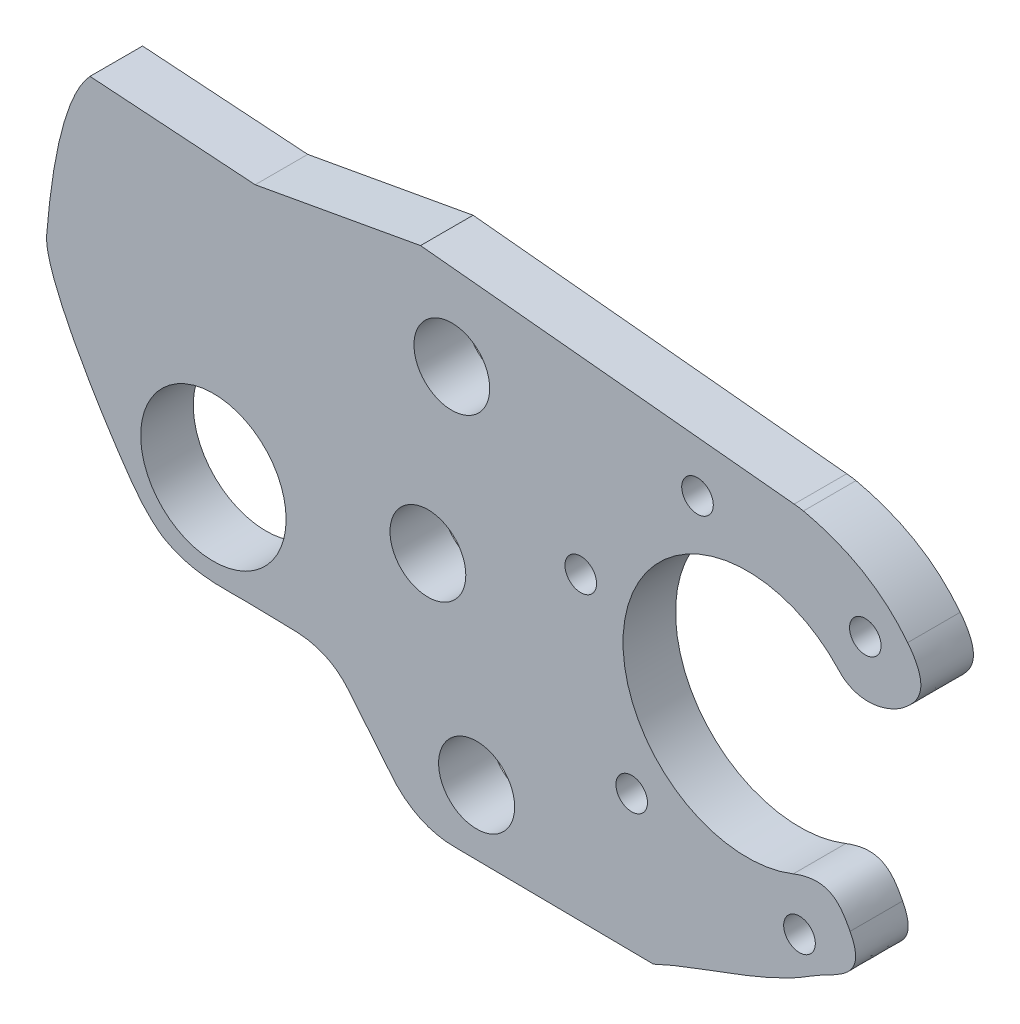
ISO-10303-21;
HEADER;
FILE_DESCRIPTION(('STEP AP214'),'2;1');
FILE_NAME('part.step','',(''),(''),'','','');
FILE_SCHEMA(('AUTOMOTIVE_DESIGN { 1 0 10303 214 1 1 1 1 }'));
ENDSEC;
DATA;
#1=APPLICATION_CONTEXT('core data for automotive mechanical design processes');
#2=APPLICATION_PROTOCOL_DEFINITION('international standard','automotive_design',2000,#1);
#3=PRODUCT_CONTEXT('',#1,'mechanical');
#4=PRODUCT('Part','Part','',(#3));
#5=PRODUCT_RELATED_PRODUCT_CATEGORY('part','',(#4));
#6=PRODUCT_DEFINITION_FORMATION('','',#4);
#7=PRODUCT_DEFINITION_CONTEXT('part definition',#1,'design');
#8=PRODUCT_DEFINITION('design','',#6,#7);
#9=PRODUCT_DEFINITION_SHAPE('','',#8);
#10=(LENGTH_UNIT() NAMED_UNIT(*) SI_UNIT(.MILLI.,.METRE.));
#11=(NAMED_UNIT(*) PLANE_ANGLE_UNIT() SI_UNIT($,.RADIAN.));
#12=(NAMED_UNIT(*) SI_UNIT($,.STERADIAN.) SOLID_ANGLE_UNIT());
#13=UNCERTAINTY_MEASURE_WITH_UNIT(LENGTH_MEASURE(1.E-05),#10,'distance_accuracy_value','');
#14=(GEOMETRIC_REPRESENTATION_CONTEXT(3) GLOBAL_UNCERTAINTY_ASSIGNED_CONTEXT((#13)) GLOBAL_UNIT_ASSIGNED_CONTEXT((#10,
#11,#12)) REPRESENTATION_CONTEXT('',''));
#15=CARTESIAN_POINT('',(0.,0.,0.));
#16=DIRECTION('',(0.,0.,1.));
#17=DIRECTION('',(1.,0.,0.));
#18=AXIS2_PLACEMENT_3D('',#15,#16,#17);
#19=CARTESIAN_POINT('',(186.901275,436.652765625,7.5));
#20=DIRECTION('',(0.,0.,-1.));
#21=DIRECTION('',(-1.,0.,0.));
#22=AXIS2_PLACEMENT_3D('',#19,#20,#21);
#23=PLANE('',#22);
#24=DIRECTION('',(-0.995119987414182,0.0986722384908675,0.));
#25=VECTOR('',#24,1.);
#26=CARTESIAN_POINT('',(291.70285305092,443.851443710822,7.5));
#27=LINE('',#26,#25);
#28=CARTESIAN_POINT('',(291.70285305092,443.851443710822,7.5));
#29=VERTEX_POINT('',#28);
#30=CARTESIAN_POINT('',(238.3788,449.13885,7.5));
#31=VERTEX_POINT('',#30);
#32=EDGE_CURVE('E1516',#29,#31,#27,.T.);
#33=ORIENTED_EDGE('',*,*,#32,.T.);
#34=DIRECTION('',(-0.983980109940813,-0.178278274730446,0.));
#35=VECTOR('',#34,1.);
#36=CARTESIAN_POINT('',(238.3788,449.13885,7.5));
#37=LINE('',#36,#35);
#38=CARTESIAN_POINT('',(214.781925,444.86355,7.5));
#39=VERTEX_POINT('',#38);
#40=EDGE_CURVE('E1289',#31,#39,#37,.T.);
#41=ORIENTED_EDGE('',*,*,#40,.T.);
#42=DIRECTION('',(-0.997687499739469,0.067968028245694,0.));
#43=VECTOR('',#42,1.);
#44=CARTESIAN_POINT('',(214.781925,444.86355,7.5));
#45=LINE('',#44,#43);
#46=CARTESIAN_POINT('',(191.205975,446.469675,7.5));
#47=VERTEX_POINT('',#46);
#48=EDGE_CURVE('E1510',#39,#47,#45,.T.);
#49=ORIENTED_EDGE('',*,*,#48,.T.);
#50=CARTESIAN_POINT('',(191.205975,446.469675,7.5));
#51=CARTESIAN_POINT('',(187.31175,442.230225,7.5));
#52=CARTESIAN_POINT('',(185.682225,432.103575,7.5));
#53=CARTESIAN_POINT('',(185.0223,423.75105,7.5));
#54=B_SPLINE_CURVE_WITH_KNOTS('',3,(#50,#51,#52,#53),.UNSPECIFIED.,.F.,.F.,(4,4),
(0.333333333333333,0.375),.UNSPECIFIED.);
#55=CARTESIAN_POINT('',(185.0223,423.75105,7.5));
#56=VERTEX_POINT('',#55);
#57=EDGE_CURVE('E1502',#47,#56,#54,.T.);
#58=ORIENTED_EDGE('',*,*,#57,.T.);
#59=CARTESIAN_POINT('',(185.0223,423.75105,7.5));
#60=CARTESIAN_POINT('',(184.6902,419.547675,7.5));
#61=CARTESIAN_POINT('',(190.36995,409.442775,7.5));
#62=CARTESIAN_POINT('',(195.177075,402.2091,7.5));
#63=B_SPLINE_CURVE_WITH_KNOTS('',3,(#59,#60,#61,#62),.UNSPECIFIED.,.F.,.F.,(4,4),(0.375,
0.416666666666667),.UNSPECIFIED.);
#64=CARTESIAN_POINT('',(195.177075,402.2091,7.5));
#65=VERTEX_POINT('',#64);
#66=EDGE_CURVE('E1498',#56,#65,#63,.T.);
#67=ORIENTED_EDGE('',*,*,#66,.T.);
#68=CARTESIAN_POINT('',(195.177075,402.2091,7.5));
#69=CARTESIAN_POINT('',(196.448625,400.2957,7.5));
#70=CARTESIAN_POINT('',(199.047375,396.168075,7.5));
#71=CARTESIAN_POINT('',(202.037325,394.500075,7.5));
#72=B_SPLINE_CURVE_WITH_KNOTS('',3,(#68,#69,#70,#71),.UNSPECIFIED.,.F.,.F.,(4,4),
(0.416666666666667,0.458333333333333),.UNSPECIFIED.);
#73=CARTESIAN_POINT('',(202.037325,394.500075,7.5));
#74=VERTEX_POINT('',#73);
#75=EDGE_CURVE('E1475',#65,#74,#72,.T.);
#76=ORIENTED_EDGE('',*,*,#75,.T.);
#77=CARTESIAN_POINT('',(202.037325,394.500075,7.5));
#78=CARTESIAN_POINT('',(206.034375,392.27025,7.5));
#79=CARTESIAN_POINT('',(210.701175,392.759325,7.5));
#80=CARTESIAN_POINT('',(213.541125,392.699775,7.5));
#81=B_SPLINE_CURVE_WITH_KNOTS('',3,(#77,#78,#79,#80),.UNSPECIFIED.,.F.,.F.,(4,4),
(0.458333333333333,0.5),.UNSPECIFIED.);
#82=CARTESIAN_POINT('',(213.541125,392.699775,7.5));
#83=VERTEX_POINT('',#82);
#84=EDGE_CURVE('E1470',#74,#83,#81,.T.);
#85=ORIENTED_EDGE('',*,*,#84,.T.);
#86=DIRECTION('',(0.999780220810121,-0.0209644956262963,0.));
#87=VECTOR('',#86,1.);
#88=CARTESIAN_POINT('',(213.541125,392.699775,7.5));
#89=LINE('',#88,#87);
#90=CARTESIAN_POINT('',(220.73385,392.54895,7.5));
#91=VERTEX_POINT('',#90);
#92=EDGE_CURVE('E1465',#83,#91,#89,.T.);
#93=ORIENTED_EDGE('',*,*,#92,.T.);
#94=CARTESIAN_POINT('',(220.73385,392.54895,7.5));
#95=CARTESIAN_POINT('',(223.992,392.3922,7.5));
#96=CARTESIAN_POINT('',(226.402275,391.1475,7.5));
#97=CARTESIAN_POINT('',(228.123675,389.018625,7.5));
#98=B_SPLINE_CURVE_WITH_KNOTS('',3,(#94,#95,#96,#97),.UNSPECIFIED.,.F.,.F.,(4,4),
(0.541666666666667,0.583333333333333),.UNSPECIFIED.);
#99=CARTESIAN_POINT('',(228.123675,389.018625,7.5));
#100=VERTEX_POINT('',#99);
#101=EDGE_CURVE('E1460',#91,#100,#98,.T.);
#102=ORIENTED_EDGE('',*,*,#101,.T.);
#103=DIRECTION('',(0.63643970205706,-0.771326458541078,0.));
#104=VECTOR('',#103,1.);
#105=CARTESIAN_POINT('',(228.123675,389.018625,7.5));
#106=LINE('',#105,#104);
#107=CARTESIAN_POINT('',(234.8802,380.830125,7.5));
#108=VERTEX_POINT('',#107);
#109=EDGE_CURVE('E1441',#100,#108,#106,.T.);
#110=ORIENTED_EDGE('',*,*,#109,.T.);
#111=CARTESIAN_POINT('',(234.8802,380.830125,7.5));
#112=CARTESIAN_POINT('',(237.1203,378.529425,7.5));
#113=CARTESIAN_POINT('',(239.8887,377.236575,7.5));
#114=CARTESIAN_POINT('',(243.337425,377.241825,7.5));
#115=B_SPLINE_CURVE_WITH_KNOTS('',3,(#111,#112,#113,#114),.UNSPECIFIED.,.F.,.F.,(4,4),(0.625,
0.666666666666667),.UNSPECIFIED.);
#116=CARTESIAN_POINT('',(243.337425,377.241825,7.5));
#117=VERTEX_POINT('',#116);
#118=EDGE_CURVE('E1436',#108,#117,#115,.T.);
#119=ORIENTED_EDGE('',*,*,#118,.T.);
#120=DIRECTION('',(0.999944246195797,-0.0105595691161274,0.));
#121=VECTOR('',#120,1.);
#122=CARTESIAN_POINT('',(243.337425,377.241825,7.5));
#123=LINE('',#122,#121);
#124=CARTESIAN_POINT('',(271.61115,376.94325,7.5));
#125=VERTEX_POINT('',#124);
#126=EDGE_CURVE('E1431',#117,#125,#123,.T.);
#127=ORIENTED_EDGE('',*,*,#126,.T.);
#128=CARTESIAN_POINT('',(271.61115,376.94325,7.5));
#129=CARTESIAN_POINT('',(277.799025,379.931025,7.5));
#130=CARTESIAN_POINT('',(287.4342,382.395075,7.5));
#131=CARTESIAN_POINT('',(293.921475,386.607675,7.5));
#132=B_SPLINE_CURVE_WITH_KNOTS('',3,(#128,#129,#130,#131),.UNSPECIFIED.,.F.,.F.,(4,4),
(0.708333333333333,0.75),.UNSPECIFIED.);
#133=CARTESIAN_POINT('',(293.921475,386.607675,7.5));
#134=VERTEX_POINT('',#133);
#135=EDGE_CURVE('E1426',#125,#134,#132,.T.);
#136=ORIENTED_EDGE('',*,*,#135,.T.);
#137=CARTESIAN_POINT('',(293.921475,386.607675,7.5));
#138=CARTESIAN_POINT('',(297.470175,388.91205,7.5));
#139=CARTESIAN_POINT('',(302.414025,389.714325,7.5));
#140=CARTESIAN_POINT('',(299.685525,395.036775,7.5));
#141=B_SPLINE_CURVE_WITH_KNOTS('',3,(#137,#138,#139,#140),.UNSPECIFIED.,.F.,.F.,(4,4),(0.75,
0.791666666666667),.UNSPECIFIED.);
#142=CARTESIAN_POINT('',(299.685525,395.036775,7.5));
#143=VERTEX_POINT('',#142);
#144=EDGE_CURVE('E1404',#134,#143,#141,.T.);
#145=ORIENTED_EDGE('',*,*,#144,.T.);
#146=CARTESIAN_POINT('',(299.685525,395.036775,7.5));
#147=CARTESIAN_POINT('',(298.2723,397.793175,7.5));
#148=CARTESIAN_POINT('',(296.635425,400.0548,7.5));
#149=CARTESIAN_POINT('',(291.575925,398.08245,7.5));
#150=B_SPLINE_CURVE_WITH_KNOTS('',3,(#146,#147,#148,#149),.UNSPECIFIED.,.F.,.F.,(4,4),
(0.791666666666667,0.833333333333333),.UNSPECIFIED.);
#151=CARTESIAN_POINT('',(291.575925,398.08245,7.5));
#152=VERTEX_POINT('',#151);
#153=EDGE_CURVE('E1399',#143,#152,#150,.T.);
#154=ORIENTED_EDGE('',*,*,#153,.T.);
#155=CARTESIAN_POINT('',(285.000663350942,414.538105839851,7.5));
#156=DIRECTION('',(0.,0.,1.));
#157=DIRECTION('',(1.,0.,0.));
#158=AXIS2_PLACEMENT_3D('',#155,#156,#157);
#159=CIRCLE('',#158,17.7206849436809);
#160=CARTESIAN_POINT('',(298.09630305092,426.476568710822,7.5));
#161=VERTEX_POINT('',#160);
#162=EDGE_CURVE('E1393',#161,#152,#159,.T.);
#163=ORIENTED_EDGE('',*,*,#162,.F.);
#164=CARTESIAN_POINT('',(298.09630305092,426.476568710822,7.5));
#165=CARTESIAN_POINT('',(300.69820305092,423.683793710822,7.5));
#166=CARTESIAN_POINT('',(304.86422805092,424.630818710822,7.5));
#167=CARTESIAN_POINT('',(307.32017805092,426.508218710822,7.5));
#168=B_SPLINE_CURVE_WITH_KNOTS('',3,(#164,#165,#166,#167),.UNSPECIFIED.,.F.,.F.,(4,4),
(0.0416666666666667,0.0833333333333333),.UNSPECIFIED.);
#169=CARTESIAN_POINT('',(307.32017805092,426.508218710822,7.5));
#170=VERTEX_POINT('',#169);
#171=EDGE_CURVE('E1345',#161,#170,#168,.T.);
#172=ORIENTED_EDGE('',*,*,#171,.T.);
#173=CARTESIAN_POINT('',(307.32017805092,426.508218710822,7.5));
#174=CARTESIAN_POINT('',(309.79840305092,428.402718710822,7.5));
#175=CARTESIAN_POINT('',(311.07040305092,430.794468710822,7.5));
#176=CARTESIAN_POINT('',(307.90405305092,434.828718710822,7.5));
#177=B_SPLINE_CURVE_WITH_KNOTS('',3,(#173,#174,#175,#176),.UNSPECIFIED.,.F.,.F.,(4,4),
(0.0833333333333333,0.125),.UNSPECIFIED.);
#178=CARTESIAN_POINT('',(307.90405305092,434.828718710822,7.5));
#179=VERTEX_POINT('',#178);
#180=EDGE_CURVE('E1338',#170,#179,#177,.T.);
#181=ORIENTED_EDGE('',*,*,#180,.T.);
#182=CARTESIAN_POINT('',(307.90405305092,434.828718710822,7.5));
#183=CARTESIAN_POINT('',(304.19552805092,439.553943710822,7.5));
#184=CARTESIAN_POINT('',(299.18740305092,442.280868710823,7.5));
#185=CARTESIAN_POINT('',(293.02682805092,443.659818710822,7.5));
#186=B_SPLINE_CURVE_WITH_KNOTS('',3,(#182,#183,#184,#185),.UNSPECIFIED.,.F.,.F.,(4,4),(0.125,
0.166666666666667),.UNSPECIFIED.);
#187=CARTESIAN_POINT('',(293.02682805092,443.659818710822,7.5));
#188=VERTEX_POINT('',#187);
#189=EDGE_CURVE('E1342',#179,#188,#186,.T.);
#190=ORIENTED_EDGE('',*,*,#189,.T.);
#191=CARTESIAN_POINT('',(293.02682805092,443.659818710822,7.5));
#192=CARTESIAN_POINT('',(292.62767805092,443.749143710822,7.5));
#193=CARTESIAN_POINT('',(292.12420305092,443.810118710822,7.5));
#194=CARTESIAN_POINT('',(291.70285305092,443.851443710822,7.5));
#195=B_SPLINE_CURVE_WITH_KNOTS('',3,(#191,#192,#193,#194),.UNSPECIFIED.,.F.,.F.,(4,4),
(0.166666666666667,0.208333333333333),.UNSPECIFIED.);
#196=EDGE_CURVE('E1210',#188,#29,#195,.T.);
#197=ORIENTED_EDGE('',*,*,#196,.T.);
#198=EDGE_LOOP('',(#33,#41,#49,#58,#67,#76,#85,#93,#102,#110,#119,#127,#136,#145,#154,#163,#172,
#181,#190,#197));
#199=FACE_BOUND('',#198,.T.);
#200=CARTESIAN_POINT('',(208.817803892442,405.705736446067,7.5));
#201=DIRECTION('',(0.,0.,1.));
#202=DIRECTION('',(1.,0.,0.));
#203=AXIS2_PLACEMENT_3D('',#200,#201,#202);
#204=CIRCLE('',#203,10.3764639600331);
#205=CARTESIAN_POINT('',(219.194267852475,405.705736446067,7.5));
#206=VERTEX_POINT('',#205);
#207=EDGE_CURVE('E1521',#206,#206,#204,.T.);
#208=ORIENTED_EDGE('',*,*,#207,.F.);
#209=EDGE_LOOP('',(#208));
#210=FACE_BOUND('',#209,.T.);
#211=CARTESIAN_POINT('',(239.430319959716,411.6295526562,7.5));
#212=DIRECTION('',(0.,0.,1.));
#213=DIRECTION('',(1.,0.,0.));
#214=AXIS2_PLACEMENT_3D('',#211,#212,#213);
#215=CIRCLE('',#214,5.40982798338035);
#216=CARTESIAN_POINT('',(244.840147943096,411.6295526562,7.5));
#217=VERTEX_POINT('',#216);
#218=EDGE_CURVE('E1522',#217,#217,#215,.T.);
#219=ORIENTED_EDGE('',*,*,#218,.F.);
#220=EDGE_LOOP('',(#219));
#221=FACE_BOUND('',#220,.T.);
#222=CARTESIAN_POINT('',(242.845461450653,436.411205284333,7.5));
#223=DIRECTION('',(0.,0.,1.));
#224=DIRECTION('',(1.,0.,0.));
#225=AXIS2_PLACEMENT_3D('',#222,#223,#224);
#226=CIRCLE('',#225,5.40379454187337);
#227=CARTESIAN_POINT('',(248.249255992527,436.411205284333,7.5));
#228=VERTEX_POINT('',#227);
#229=EDGE_CURVE('E1529',#228,#228,#226,.T.);
#230=ORIENTED_EDGE('',*,*,#229,.F.);
#231=EDGE_LOOP('',(#230));
#232=FACE_BOUND('',#231,.T.);
#233=CARTESIAN_POINT('',(246.384365075959,386.462532235509,7.5));
#234=DIRECTION('',(0.,0.,1.));
#235=DIRECTION('',(1.,0.,0.));
#236=AXIS2_PLACEMENT_3D('',#233,#234,#235);
#237=CIRCLE('',#236,5.42669333028115);
#238=CARTESIAN_POINT('',(251.811058406241,386.462532235509,7.5));
#239=VERTEX_POINT('',#238);
#240=EDGE_CURVE('E1535',#239,#239,#237,.T.);
#241=ORIENTED_EDGE('',*,*,#240,.F.);
#242=EDGE_LOOP('',(#241));
#243=FACE_BOUND('',#242,.T.);
#244=CARTESIAN_POINT('',(268.520513510161,396.478787768311,7.5));
#245=DIRECTION('',(0.,0.,1.));
#246=DIRECTION('',(1.,0.,0.));
#247=AXIS2_PLACEMENT_3D('',#244,#245,#246);
#248=CIRCLE('',#247,2.25216256245953);
#249=CARTESIAN_POINT('',(270.772676072621,396.478787768311,7.5));
#250=VERTEX_POINT('',#249);
#251=EDGE_CURVE('E1541',#250,#250,#248,.T.);
#252=ORIENTED_EDGE('',*,*,#251,.F.);
#253=EDGE_LOOP('',(#252));
#254=FACE_BOUND('',#253,.T.);
#255=CARTESIAN_POINT('',(292.465169378376,391.048756648815,7.5));
#256=DIRECTION('',(0.,0.,1.));
#257=DIRECTION('',(1.,0.,0.));
#258=AXIS2_PLACEMENT_3D('',#255,#256,#257);
#259=CIRCLE('',#258,2.25849055282965);
#260=CARTESIAN_POINT('',(294.723659931205,391.048756648815,7.5));
#261=VERTEX_POINT('',#260);
#262=EDGE_CURVE('E1547',#261,#261,#259,.T.);
#263=ORIENTED_EDGE('',*,*,#262,.F.);
#264=EDGE_LOOP('',(#263));
#265=FACE_BOUND('',#264,.T.);
#266=CARTESIAN_POINT('',(261.247077462919,419.928966562069,7.5));
#267=DIRECTION('',(0.,0.,1.));
#268=DIRECTION('',(1.,0.,0.));
#269=AXIS2_PLACEMENT_3D('',#266,#267,#268);
#270=CIRCLE('',#269,2.25705802357734);
#271=CARTESIAN_POINT('',(263.504135486497,419.928966562069,7.5));
#272=VERTEX_POINT('',#271);
#273=EDGE_CURVE('E1553',#272,#272,#270,.T.);
#274=ORIENTED_EDGE('',*,*,#273,.F.);
#275=EDGE_LOOP('',(#274));
#276=FACE_BOUND('',#275,.T.);
#277=CARTESIAN_POINT('',(277.909738754834,437.960830881056,7.5));
#278=DIRECTION('',(0.,0.,1.));
#279=DIRECTION('',(1.,0.,0.));
#280=AXIS2_PLACEMENT_3D('',#277,#278,#279);
#281=CIRCLE('',#280,2.25484862473163);
#282=CARTESIAN_POINT('',(280.164587379566,437.960830881056,7.5));
#283=VERTEX_POINT('',#282);
#284=EDGE_CURVE('E1559',#283,#283,#281,.T.);
#285=ORIENTED_EDGE('',*,*,#284,.F.);
#286=EDGE_LOOP('',(#285));
#287=FACE_BOUND('',#286,.T.);
#288=CARTESIAN_POINT('',(301.85658389909,432.537310817509,7.5));
#289=DIRECTION('',(0.,0.,1.));
#290=DIRECTION('',(1.,0.,0.));
#291=AXIS2_PLACEMENT_3D('',#288,#289,#290);
#292=CIRCLE('',#291,2.25216599519371);
#293=CARTESIAN_POINT('',(304.108749894284,432.537310817509,7.5));
#294=VERTEX_POINT('',#293);
#295=EDGE_CURVE('E1565',#294,#294,#292,.T.);
#296=ORIENTED_EDGE('',*,*,#295,.F.);
#297=EDGE_LOOP('',(#296));
#298=FACE_BOUND('',#297,.T.);
#299=ADVANCED_FACE('F1193',(#199,#210,#221,#232,#243,#254,#265,#276,#287,#298),#23,.F.);
#300=CARTESIAN_POINT('',(186.901275,436.652765625,0.));
#301=DIRECTION('',(0.,0.,-1.));
#302=DIRECTION('',(-1.,0.,0.));
#303=AXIS2_PLACEMENT_3D('',#300,#301,#302);
#304=PLANE('',#303);
#305=CARTESIAN_POINT('',(277.909738754834,437.960830881056,0.));
#306=DIRECTION('',(0.,0.,1.));
#307=DIRECTION('',(1.,0.,0.));
#308=AXIS2_PLACEMENT_3D('',#305,#306,#307);
#309=CIRCLE('',#308,2.25484862473163);
#310=CARTESIAN_POINT('',(280.164587379566,437.960830881056,0.));
#311=VERTEX_POINT('',#310);
#312=EDGE_CURVE('E1562',#311,#311,#309,.T.);
#313=ORIENTED_EDGE('',*,*,#312,.T.);
#314=EDGE_LOOP('',(#313));
#315=FACE_BOUND('',#314,.T.);
#316=CARTESIAN_POINT('',(292.465169378376,391.048756648815,0.));
#317=DIRECTION('',(0.,0.,1.));
#318=DIRECTION('',(1.,0.,0.));
#319=AXIS2_PLACEMENT_3D('',#316,#317,#318);
#320=CIRCLE('',#319,2.25849055282965);
#321=CARTESIAN_POINT('',(294.723659931205,391.048756648815,0.));
#322=VERTEX_POINT('',#321);
#323=EDGE_CURVE('E1550',#322,#322,#320,.T.);
#324=ORIENTED_EDGE('',*,*,#323,.T.);
#325=EDGE_LOOP('',(#324));
#326=FACE_BOUND('',#325,.T.);
#327=CARTESIAN_POINT('',(246.384365075959,386.462532235509,0.));
#328=DIRECTION('',(0.,0.,1.));
#329=DIRECTION('',(1.,0.,0.));
#330=AXIS2_PLACEMENT_3D('',#327,#328,#329);
#331=CIRCLE('',#330,5.42669333028115);
#332=CARTESIAN_POINT('',(251.811058406241,386.462532235509,0.));
#333=VERTEX_POINT('',#332);
#334=EDGE_CURVE('E1538',#333,#333,#331,.T.);
#335=ORIENTED_EDGE('',*,*,#334,.T.);
#336=EDGE_LOOP('',(#335));
#337=FACE_BOUND('',#336,.T.);
#338=CARTESIAN_POINT('',(239.430319959716,411.6295526562,0.));
#339=DIRECTION('',(0.,0.,1.));
#340=DIRECTION('',(1.,0.,0.));
#341=AXIS2_PLACEMENT_3D('',#338,#339,#340);
#342=CIRCLE('',#341,5.40982798338035);
#343=CARTESIAN_POINT('',(244.840147943096,411.6295526562,0.));
#344=VERTEX_POINT('',#343);
#345=EDGE_CURVE('E1526',#344,#344,#342,.T.);
#346=ORIENTED_EDGE('',*,*,#345,.T.);
#347=EDGE_LOOP('',(#346));
#348=FACE_BOUND('',#347,.T.);
#349=DIRECTION('',(-0.995119987414182,0.0986722384908675,0.));
#350=VECTOR('',#349,1.);
#351=CARTESIAN_POINT('',(291.70285305092,443.851443710822,0.));
#352=LINE('',#351,#350);
#353=CARTESIAN_POINT('',(291.70285305092,443.851443710822,0.));
#354=VERTEX_POINT('',#353);
#355=CARTESIAN_POINT('',(238.3788,449.13885,0.));
#356=VERTEX_POINT('',#355);
#357=EDGE_CURVE('E1525',#354,#356,#352,.T.);
#358=ORIENTED_EDGE('',*,*,#357,.F.);
#359=CARTESIAN_POINT('',(293.02682805092,443.659818710822,0.));
#360=CARTESIAN_POINT('',(292.62767805092,443.749143710822,0.));
#361=CARTESIAN_POINT('',(292.12420305092,443.810118710822,0.));
#362=CARTESIAN_POINT('',(291.70285305092,443.851443710822,0.));
#363=B_SPLINE_CURVE_WITH_KNOTS('',3,(#359,#360,#361,#362),.UNSPECIFIED.,.F.,.F.,(4,4),
(0.166666666666667,0.208333333333333),.UNSPECIFIED.);
#364=CARTESIAN_POINT('',(293.02682805092,443.659818710822,0.));
#365=VERTEX_POINT('',#364);
#366=EDGE_CURVE('E1281',#365,#354,#363,.T.);
#367=ORIENTED_EDGE('',*,*,#366,.F.);
#368=CARTESIAN_POINT('',(307.90405305092,434.828718710822,0.));
#369=CARTESIAN_POINT('',(304.19552805092,439.553943710822,0.));
#370=CARTESIAN_POINT('',(299.18740305092,442.280868710823,0.));
#371=CARTESIAN_POINT('',(293.02682805092,443.659818710822,0.));
#372=B_SPLINE_CURVE_WITH_KNOTS('',3,(#368,#369,#370,#371),.UNSPECIFIED.,.F.,.F.,(4,4),(0.125,
0.166666666666667),.UNSPECIFIED.);
#373=CARTESIAN_POINT('',(307.90405305092,434.828718710822,0.));
#374=VERTEX_POINT('',#373);
#375=EDGE_CURVE('E1275',#374,#365,#372,.T.);
#376=ORIENTED_EDGE('',*,*,#375,.F.);
#377=CARTESIAN_POINT('',(307.32017805092,426.508218710822,0.));
#378=CARTESIAN_POINT('',(309.79840305092,428.402718710822,0.));
#379=CARTESIAN_POINT('',(311.07040305092,430.794468710822,0.));
#380=CARTESIAN_POINT('',(307.90405305092,434.828718710822,0.));
#381=B_SPLINE_CURVE_WITH_KNOTS('',3,(#377,#378,#379,#380),.UNSPECIFIED.,.F.,.F.,(4,4),
(0.0833333333333333,0.125),.UNSPECIFIED.);
#382=CARTESIAN_POINT('',(307.32017805092,426.508218710822,0.));
#383=VERTEX_POINT('',#382);
#384=EDGE_CURVE('E1353',#383,#374,#381,.T.);
#385=ORIENTED_EDGE('',*,*,#384,.F.);
#386=CARTESIAN_POINT('',(298.09630305092,426.476568710822,0.));
#387=CARTESIAN_POINT('',(300.69820305092,423.683793710822,0.));
#388=CARTESIAN_POINT('',(304.86422805092,424.630818710822,0.));
#389=CARTESIAN_POINT('',(307.32017805092,426.508218710822,0.));
#390=B_SPLINE_CURVE_WITH_KNOTS('',3,(#386,#387,#388,#389),.UNSPECIFIED.,.F.,.F.,(4,4),
(0.0416666666666667,0.0833333333333333),.UNSPECIFIED.);
#391=CARTESIAN_POINT('',(298.09630305092,426.476568710822,0.));
#392=VERTEX_POINT('',#391);
#393=EDGE_CURVE('E1949',#392,#383,#390,.T.);
#394=ORIENTED_EDGE('',*,*,#393,.F.);
#395=CARTESIAN_POINT('',(285.000663350942,414.538105839851,0.));
#396=DIRECTION('',(0.,0.,1.));
#397=DIRECTION('',(1.,0.,0.));
#398=AXIS2_PLACEMENT_3D('',#395,#396,#397);
#399=CIRCLE('',#398,17.7206849436809);
#400=CARTESIAN_POINT('',(291.575925,398.08245,0.));
#401=VERTEX_POINT('',#400);
#402=EDGE_CURVE('E1943',#392,#401,#399,.T.);
#403=ORIENTED_EDGE('',*,*,#402,.T.);
#404=CARTESIAN_POINT('',(299.685525,395.036775,0.));
#405=CARTESIAN_POINT('',(298.2723,397.793175,0.));
#406=CARTESIAN_POINT('',(296.635425,400.0548,0.));
#407=CARTESIAN_POINT('',(291.575925,398.08245,0.));
#408=B_SPLINE_CURVE_WITH_KNOTS('',3,(#404,#405,#406,#407),.UNSPECIFIED.,.F.,.F.,(4,4),
(0.791666666666667,0.833333333333333),.UNSPECIFIED.);
#409=CARTESIAN_POINT('',(299.685525,395.036775,0.));
#410=VERTEX_POINT('',#409);
#411=EDGE_CURVE('E1935',#410,#401,#408,.T.);
#412=ORIENTED_EDGE('',*,*,#411,.F.);
#413=CARTESIAN_POINT('',(293.921475,386.607675,0.));
#414=CARTESIAN_POINT('',(297.470175,388.91205,0.));
#415=CARTESIAN_POINT('',(302.414025,389.714325,0.));
#416=CARTESIAN_POINT('',(299.685525,395.036775,0.));
#417=B_SPLINE_CURVE_WITH_KNOTS('',3,(#413,#414,#415,#416),.UNSPECIFIED.,.F.,.F.,(4,4),(0.75,
0.791666666666667),.UNSPECIFIED.);
#418=CARTESIAN_POINT('',(293.921475,386.607675,0.));
#419=VERTEX_POINT('',#418);
#420=EDGE_CURVE('E1928',#419,#410,#417,.T.);
#421=ORIENTED_EDGE('',*,*,#420,.F.);
#422=CARTESIAN_POINT('',(271.61115,376.94325,0.));
#423=CARTESIAN_POINT('',(277.799025,379.931025,0.));
#424=CARTESIAN_POINT('',(287.4342,382.395075,0.));
#425=CARTESIAN_POINT('',(293.921475,386.607675,0.));
#426=B_SPLINE_CURVE_WITH_KNOTS('',3,(#422,#423,#424,#425),.UNSPECIFIED.,.F.,.F.,(4,4),
(0.708333333333333,0.75),.UNSPECIFIED.);
#427=CARTESIAN_POINT('',(271.61115,376.94325,0.));
#428=VERTEX_POINT('',#427);
#429=EDGE_CURVE('E1924',#428,#419,#426,.T.);
#430=ORIENTED_EDGE('',*,*,#429,.F.);
#431=DIRECTION('',(0.999944246195797,-0.0105595691161274,0.));
#432=VECTOR('',#431,1.);
#433=CARTESIAN_POINT('',(243.337425,377.241825,0.));
#434=LINE('',#433,#432);
#435=CARTESIAN_POINT('',(243.337425,377.241825,0.));
#436=VERTEX_POINT('',#435);
#437=EDGE_CURVE('E1919',#436,#428,#434,.T.);
#438=ORIENTED_EDGE('',*,*,#437,.F.);
#439=CARTESIAN_POINT('',(234.8802,380.830125,0.));
#440=CARTESIAN_POINT('',(237.1203,378.529425,0.));
#441=CARTESIAN_POINT('',(239.8887,377.236575,0.));
#442=CARTESIAN_POINT('',(243.337425,377.241825,0.));
#443=B_SPLINE_CURVE_WITH_KNOTS('',3,(#439,#440,#441,#442),.UNSPECIFIED.,.F.,.F.,(4,4),(0.625,
0.666666666666667),.UNSPECIFIED.);
#444=CARTESIAN_POINT('',(234.8802,380.830125,0.));
#445=VERTEX_POINT('',#444);
#446=EDGE_CURVE('E1915',#445,#436,#443,.T.);
#447=ORIENTED_EDGE('',*,*,#446,.F.);
#448=DIRECTION('',(0.63643970205706,-0.771326458541078,0.));
#449=VECTOR('',#448,1.);
#450=CARTESIAN_POINT('',(228.123675,389.018625,0.));
#451=LINE('',#450,#449);
#452=CARTESIAN_POINT('',(228.123675,389.018625,0.));
#453=VERTEX_POINT('',#452);
#454=EDGE_CURVE('E1910',#453,#445,#451,.T.);
#455=ORIENTED_EDGE('',*,*,#454,.F.);
#456=CARTESIAN_POINT('',(220.73385,392.54895,0.));
#457=CARTESIAN_POINT('',(223.992,392.3922,0.));
#458=CARTESIAN_POINT('',(226.402275,391.1475,0.));
#459=CARTESIAN_POINT('',(228.123675,389.018625,0.));
#460=B_SPLINE_CURVE_WITH_KNOTS('',3,(#456,#457,#458,#459),.UNSPECIFIED.,.F.,.F.,(4,4),
(0.541666666666667,0.583333333333333),.UNSPECIFIED.);
#461=CARTESIAN_POINT('',(220.73385,392.54895,0.));
#462=VERTEX_POINT('',#461);
#463=EDGE_CURVE('E1906',#462,#453,#460,.T.);
#464=ORIENTED_EDGE('',*,*,#463,.F.);
#465=DIRECTION('',(0.999780220810121,-0.0209644956262963,0.));
#466=VECTOR('',#465,1.);
#467=CARTESIAN_POINT('',(213.541125,392.699775,0.));
#468=LINE('',#467,#466);
#469=CARTESIAN_POINT('',(213.541125,392.699775,0.));
#470=VERTEX_POINT('',#469);
#471=EDGE_CURVE('E1901',#470,#462,#468,.T.);
#472=ORIENTED_EDGE('',*,*,#471,.F.);
#473=CARTESIAN_POINT('',(202.037325,394.500075,0.));
#474=CARTESIAN_POINT('',(206.034375,392.27025,0.));
#475=CARTESIAN_POINT('',(210.701175,392.759325,0.));
#476=CARTESIAN_POINT('',(213.541125,392.699775,0.));
#477=B_SPLINE_CURVE_WITH_KNOTS('',3,(#473,#474,#475,#476),.UNSPECIFIED.,.F.,.F.,(4,4),
(0.458333333333333,0.5),.UNSPECIFIED.);
#478=CARTESIAN_POINT('',(202.037325,394.500075,0.));
#479=VERTEX_POINT('',#478);
#480=EDGE_CURVE('E1894',#479,#470,#477,.T.);
#481=ORIENTED_EDGE('',*,*,#480,.F.);
#482=CARTESIAN_POINT('',(195.177075,402.2091,0.));
#483=CARTESIAN_POINT('',(196.448625,400.2957,0.));
#484=CARTESIAN_POINT('',(199.047375,396.168075,0.));
#485=CARTESIAN_POINT('',(202.037325,394.500075,0.));
#486=B_SPLINE_CURVE_WITH_KNOTS('',3,(#482,#483,#484,#485),.UNSPECIFIED.,.F.,.F.,(4,4),
(0.416666666666667,0.458333333333333),.UNSPECIFIED.);
#487=CARTESIAN_POINT('',(195.177075,402.2091,0.));
#488=VERTEX_POINT('',#487);
#489=EDGE_CURVE('E1887',#488,#479,#486,.T.);
#490=ORIENTED_EDGE('',*,*,#489,.F.);
#491=CARTESIAN_POINT('',(185.0223,423.75105,0.));
#492=CARTESIAN_POINT('',(184.6902,419.547675,0.));
#493=CARTESIAN_POINT('',(190.36995,409.442775,0.));
#494=CARTESIAN_POINT('',(195.177075,402.2091,0.));
#495=B_SPLINE_CURVE_WITH_KNOTS('',3,(#491,#492,#493,#494),.UNSPECIFIED.,.F.,.F.,(4,4),(0.375,
0.416666666666667),.UNSPECIFIED.);
#496=CARTESIAN_POINT('',(185.0223,423.75105,0.));
#497=VERTEX_POINT('',#496);
#498=EDGE_CURVE('E1880',#497,#488,#495,.T.);
#499=ORIENTED_EDGE('',*,*,#498,.F.);
#500=CARTESIAN_POINT('',(191.205975,446.469675,0.));
#501=CARTESIAN_POINT('',(187.31175,442.230225,0.));
#502=CARTESIAN_POINT('',(185.682225,432.103575,0.));
#503=CARTESIAN_POINT('',(185.0223,423.75105,0.));
#504=B_SPLINE_CURVE_WITH_KNOTS('',3,(#500,#501,#502,#503),.UNSPECIFIED.,.F.,.F.,(4,4),
(0.333333333333333,0.375),.UNSPECIFIED.);
#505=CARTESIAN_POINT('',(191.205975,446.469675,0.));
#506=VERTEX_POINT('',#505);
#507=EDGE_CURVE('E1876',#506,#497,#504,.T.);
#508=ORIENTED_EDGE('',*,*,#507,.F.);
#509=DIRECTION('',(-0.997687499739469,0.067968028245694,0.));
#510=VECTOR('',#509,1.);
#511=CARTESIAN_POINT('',(214.781925,444.86355,0.));
#512=LINE('',#511,#510);
#513=CARTESIAN_POINT('',(214.781925,444.86355,0.));
#514=VERTEX_POINT('',#513);
#515=EDGE_CURVE('E1872',#514,#506,#512,.T.);
#516=ORIENTED_EDGE('',*,*,#515,.F.);
#517=DIRECTION('',(-0.983980109940813,-0.178278274730446,0.));
#518=VECTOR('',#517,1.);
#519=CARTESIAN_POINT('',(238.3788,449.13885,0.));
#520=LINE('',#519,#518);
#521=EDGE_CURVE('E1871',#356,#514,#520,.T.);
#522=ORIENTED_EDGE('',*,*,#521,.F.);
#523=EDGE_LOOP('',(#358,#367,#376,#385,#394,#403,#412,#421,#430,#438,#447,#455,#464,#472,#481,
#490,#499,#508,#516,#522));
#524=FACE_BOUND('',#523,.T.);
#525=CARTESIAN_POINT('',(208.817803892442,405.705736446067,0.));
#526=DIRECTION('',(0.,0.,1.));
#527=DIRECTION('',(1.,0.,0.));
#528=AXIS2_PLACEMENT_3D('',#525,#526,#527);
#529=CIRCLE('',#528,10.3764639600331);
#530=CARTESIAN_POINT('',(219.194267852475,405.705736446067,0.));
#531=VERTEX_POINT('',#530);
#532=EDGE_CURVE('E1518',#531,#531,#529,.T.);
#533=ORIENTED_EDGE('',*,*,#532,.T.);
#534=EDGE_LOOP('',(#533));
#535=FACE_BOUND('',#534,.T.);
#536=CARTESIAN_POINT('',(242.845461450653,436.411205284333,0.));
#537=DIRECTION('',(0.,0.,1.));
#538=DIRECTION('',(1.,0.,0.));
#539=AXIS2_PLACEMENT_3D('',#536,#537,#538);
#540=CIRCLE('',#539,5.40379454187337);
#541=CARTESIAN_POINT('',(248.249255992527,436.411205284333,0.));
#542=VERTEX_POINT('',#541);
#543=EDGE_CURVE('E1532',#542,#542,#540,.T.);
#544=ORIENTED_EDGE('',*,*,#543,.T.);
#545=EDGE_LOOP('',(#544));
#546=FACE_BOUND('',#545,.T.);
#547=CARTESIAN_POINT('',(268.520513510161,396.478787768311,0.));
#548=DIRECTION('',(0.,0.,1.));
#549=DIRECTION('',(1.,0.,0.));
#550=AXIS2_PLACEMENT_3D('',#547,#548,#549);
#551=CIRCLE('',#550,2.25216256245953);
#552=CARTESIAN_POINT('',(270.772676072621,396.478787768311,0.));
#553=VERTEX_POINT('',#552);
#554=EDGE_CURVE('E1544',#553,#553,#551,.T.);
#555=ORIENTED_EDGE('',*,*,#554,.T.);
#556=EDGE_LOOP('',(#555));
#557=FACE_BOUND('',#556,.T.);
#558=CARTESIAN_POINT('',(261.247077462919,419.928966562069,0.));
#559=DIRECTION('',(0.,0.,1.));
#560=DIRECTION('',(1.,0.,0.));
#561=AXIS2_PLACEMENT_3D('',#558,#559,#560);
#562=CIRCLE('',#561,2.25705802357734);
#563=CARTESIAN_POINT('',(263.504135486497,419.928966562069,0.));
#564=VERTEX_POINT('',#563);
#565=EDGE_CURVE('E1556',#564,#564,#562,.T.);
#566=ORIENTED_EDGE('',*,*,#565,.T.);
#567=EDGE_LOOP('',(#566));
#568=FACE_BOUND('',#567,.T.);
#569=CARTESIAN_POINT('',(301.85658389909,432.537310817509,0.));
#570=DIRECTION('',(0.,0.,1.));
#571=DIRECTION('',(1.,0.,0.));
#572=AXIS2_PLACEMENT_3D('',#569,#570,#571);
#573=CIRCLE('',#572,2.25216599519371);
#574=CARTESIAN_POINT('',(304.108749894284,432.537310817509,0.));
#575=VERTEX_POINT('',#574);
#576=EDGE_CURVE('E1568',#575,#575,#573,.T.);
#577=ORIENTED_EDGE('',*,*,#576,.T.);
#578=EDGE_LOOP('',(#577));
#579=FACE_BOUND('',#578,.T.);
#580=ADVANCED_FACE('F1578',(#315,#326,#337,#348,#524,#535,#546,#557,#568,#579),#304,.T.);
#581=CARTESIAN_POINT('',(291.70285305092,443.851443710822,7.5));
#582=DIRECTION('',(-0.0986722384908674,-0.995119987414182,0.));
#583=DIRECTION('',(0.995119987414182,-0.0986722384908675,0.));
#584=AXIS2_PLACEMENT_3D('',#581,#582,#583);
#585=PLANE('',#584);
#586=ORIENTED_EDGE('',*,*,#357,.T.);
#587=DIRECTION('',(0.,0.,-1.));
#588=VECTOR('',#587,1.);
#589=CARTESIAN_POINT('',(238.3788,449.13885,7.5));
#590=LINE('',#589,#588);
#591=EDGE_CURVE('E12',#31,#356,#590,.T.);
#592=ORIENTED_EDGE('',*,*,#591,.F.);
#593=ORIENTED_EDGE('',*,*,#32,.F.);
#594=DIRECTION('',(0.,0.,-1.));
#595=VECTOR('',#594,1.);
#596=CARTESIAN_POINT('',(291.70285305092,443.851443710822,7.5));
#597=LINE('',#596,#595);
#598=EDGE_CURVE('E1359',#29,#354,#597,.T.);
#599=ORIENTED_EDGE('',*,*,#598,.T.);
#600=EDGE_LOOP('',(#586,#592,#593,#599));
#601=FACE_BOUND('',#600,.T.);
#602=ADVANCED_FACE('F1195',(#601),#585,.F.);
#603=CARTESIAN_POINT('',(238.3788,449.13885,7.5));
#604=DIRECTION('',(0.178278274730446,-0.983980109940814,0.));
#605=DIRECTION('',(0.983980109940814,0.178278274730446,0.));
#606=AXIS2_PLACEMENT_3D('',#603,#604,#605);
#607=PLANE('',#606);
#608=ORIENTED_EDGE('',*,*,#521,.T.);
#609=DIRECTION('',(0.,0.,-1.));
#610=VECTOR('',#609,1.);
#611=CARTESIAN_POINT('',(214.781925,444.86355,7.5));
#612=LINE('',#611,#610);
#613=EDGE_CURVE('E1202',#39,#514,#612,.T.);
#614=ORIENTED_EDGE('',*,*,#613,.F.);
#615=ORIENTED_EDGE('',*,*,#40,.F.);
#616=ORIENTED_EDGE('',*,*,#591,.T.);
#617=EDGE_LOOP('',(#608,#614,#615,#616));
#618=FACE_BOUND('',#617,.T.);
#619=ADVANCED_FACE('F1736',(#618),#607,.F.);
#620=CARTESIAN_POINT('',(214.781925,444.86355,7.5));
#621=DIRECTION('',(-0.067968028245694,-0.997687499739469,0.));
#622=DIRECTION('',(0.997687499739469,-0.067968028245694,0.));
#623=AXIS2_PLACEMENT_3D('',#620,#621,#622);
#624=PLANE('',#623);
#625=ORIENTED_EDGE('',*,*,#515,.T.);
#626=DIRECTION('',(0.,0.,-1.));
#627=VECTOR('',#626,1.);
#628=CARTESIAN_POINT('',(191.205975,446.469675,7.5));
#629=LINE('',#628,#627);
#630=EDGE_CURVE('E2014',#47,#506,#629,.T.);
#631=ORIENTED_EDGE('',*,*,#630,.F.);
#632=ORIENTED_EDGE('',*,*,#48,.F.);
#633=ORIENTED_EDGE('',*,*,#613,.T.);
#634=EDGE_LOOP('',(#625,#631,#632,#633));
#635=FACE_BOUND('',#634,.T.);
#636=ADVANCED_FACE('F1729',(#635),#624,.F.);
#637=DIRECTION('',(0.,0.,-1.));
#638=VECTOR('',#637,1.);
#639=SURFACE_OF_LINEAR_EXTRUSION('',#54,#638);
#640=ORIENTED_EDGE('',*,*,#507,.T.);
#641=DIRECTION('',(0.,0.,-1.));
#642=VECTOR('',#641,1.);
#643=CARTESIAN_POINT('',(185.0223,423.75105,7.5));
#644=LINE('',#643,#642);
#645=EDGE_CURVE('E2011',#56,#497,#644,.T.);
#646=ORIENTED_EDGE('',*,*,#645,.F.);
#647=ORIENTED_EDGE('',*,*,#57,.F.);
#648=ORIENTED_EDGE('',*,*,#630,.T.);
#649=EDGE_LOOP('',(#640,#646,#647,#648));
#650=FACE_BOUND('',#649,.T.);
#651=ADVANCED_FACE('F1494',(#650),#639,.F.);
#652=DIRECTION('',(0.,0.,-1.));
#653=VECTOR('',#652,1.);
#654=SURFACE_OF_LINEAR_EXTRUSION('',#63,#653);
#655=ORIENTED_EDGE('',*,*,#498,.T.);
#656=DIRECTION('',(0.,0.,-1.));
#657=VECTOR('',#656,1.);
#658=CARTESIAN_POINT('',(195.177075,402.2091,7.5));
#659=LINE('',#658,#657);
#660=EDGE_CURVE('E2008',#65,#488,#659,.T.);
#661=ORIENTED_EDGE('',*,*,#660,.F.);
#662=ORIENTED_EDGE('',*,*,#66,.F.);
#663=ORIENTED_EDGE('',*,*,#645,.T.);
#664=EDGE_LOOP('',(#655,#661,#662,#663));
#665=FACE_BOUND('',#664,.T.);
#666=ADVANCED_FACE('F1490',(#665),#654,.F.);
#667=DIRECTION('',(0.,0.,-1.));
#668=VECTOR('',#667,1.);
#669=SURFACE_OF_LINEAR_EXTRUSION('',#72,#668);
#670=ORIENTED_EDGE('',*,*,#489,.T.);
#671=DIRECTION('',(0.,0.,-1.));
#672=VECTOR('',#671,1.);
#673=CARTESIAN_POINT('',(202.037325,394.500075,7.5));
#674=LINE('',#673,#672);
#675=EDGE_CURVE('E2005',#74,#479,#674,.T.);
#676=ORIENTED_EDGE('',*,*,#675,.F.);
#677=ORIENTED_EDGE('',*,*,#75,.F.);
#678=ORIENTED_EDGE('',*,*,#660,.T.);
#679=EDGE_LOOP('',(#670,#676,#677,#678));
#680=FACE_BOUND('',#679,.T.);
#681=ADVANCED_FACE('F1486',(#680),#669,.F.);
#682=DIRECTION('',(0.,0.,-1.));
#683=VECTOR('',#682,1.);
#684=SURFACE_OF_LINEAR_EXTRUSION('',#81,#683);
#685=ORIENTED_EDGE('',*,*,#480,.T.);
#686=DIRECTION('',(0.,0.,-1.));
#687=VECTOR('',#686,1.);
#688=CARTESIAN_POINT('',(213.541125,392.699775,7.5));
#689=LINE('',#688,#687);
#690=EDGE_CURVE('E2002',#83,#470,#689,.T.);
#691=ORIENTED_EDGE('',*,*,#690,.F.);
#692=ORIENTED_EDGE('',*,*,#84,.F.);
#693=ORIENTED_EDGE('',*,*,#675,.T.);
#694=EDGE_LOOP('',(#685,#691,#692,#693));
#695=FACE_BOUND('',#694,.T.);
#696=ADVANCED_FACE('F1483',(#695),#684,.F.);
#697=CARTESIAN_POINT('',(213.541125,392.699775,7.5));
#698=DIRECTION('',(0.0209644956262963,0.999780220810121,0.));
#699=DIRECTION('',(-0.999780220810121,0.0209644956262963,0.));
#700=AXIS2_PLACEMENT_3D('',#697,#698,#699);
#701=PLANE('',#700);
#702=ORIENTED_EDGE('',*,*,#471,.T.);
#703=DIRECTION('',(0.,0.,-1.));
#704=VECTOR('',#703,1.);
#705=CARTESIAN_POINT('',(220.73385,392.54895,7.5));
#706=LINE('',#705,#704);
#707=EDGE_CURVE('E1999',#91,#462,#706,.T.);
#708=ORIENTED_EDGE('',*,*,#707,.F.);
#709=ORIENTED_EDGE('',*,*,#92,.F.);
#710=ORIENTED_EDGE('',*,*,#690,.T.);
#711=EDGE_LOOP('',(#702,#708,#709,#710));
#712=FACE_BOUND('',#711,.T.);
#713=ADVANCED_FACE('F1457',(#712),#701,.F.);
#714=DIRECTION('',(0.,0.,-1.));
#715=VECTOR('',#714,1.);
#716=SURFACE_OF_LINEAR_EXTRUSION('',#98,#715);
#717=ORIENTED_EDGE('',*,*,#463,.T.);
#718=DIRECTION('',(0.,0.,-1.));
#719=VECTOR('',#718,1.);
#720=CARTESIAN_POINT('',(228.123675,389.018625,7.5));
#721=LINE('',#720,#719);
#722=EDGE_CURVE('E1996',#100,#453,#721,.T.);
#723=ORIENTED_EDGE('',*,*,#722,.F.);
#724=ORIENTED_EDGE('',*,*,#101,.F.);
#725=ORIENTED_EDGE('',*,*,#707,.T.);
#726=EDGE_LOOP('',(#717,#723,#724,#725));
#727=FACE_BOUND('',#726,.T.);
#728=ADVANCED_FACE('F1453',(#727),#716,.F.);
#729=CARTESIAN_POINT('',(228.123675,389.018625,7.5));
#730=DIRECTION('',(0.771326458541078,0.63643970205706,0.));
#731=DIRECTION('',(-0.63643970205706,0.771326458541078,0.));
#732=AXIS2_PLACEMENT_3D('',#729,#730,#731);
#733=PLANE('',#732);
#734=ORIENTED_EDGE('',*,*,#454,.T.);
#735=DIRECTION('',(0.,0.,-1.));
#736=VECTOR('',#735,1.);
#737=CARTESIAN_POINT('',(234.8802,380.830125,7.5));
#738=LINE('',#737,#736);
#739=EDGE_CURVE('E1993',#108,#445,#738,.T.);
#740=ORIENTED_EDGE('',*,*,#739,.F.);
#741=ORIENTED_EDGE('',*,*,#109,.F.);
#742=ORIENTED_EDGE('',*,*,#722,.T.);
#743=EDGE_LOOP('',(#734,#740,#741,#742));
#744=FACE_BOUND('',#743,.T.);
#745=ADVANCED_FACE('F1449',(#744),#733,.F.);
#746=DIRECTION('',(0.,0.,-1.));
#747=VECTOR('',#746,1.);
#748=SURFACE_OF_LINEAR_EXTRUSION('',#115,#747);
#749=ORIENTED_EDGE('',*,*,#446,.T.);
#750=DIRECTION('',(0.,0.,-1.));
#751=VECTOR('',#750,1.);
#752=CARTESIAN_POINT('',(243.337425,377.241825,7.5));
#753=LINE('',#752,#751);
#754=EDGE_CURVE('E1990',#117,#436,#753,.T.);
#755=ORIENTED_EDGE('',*,*,#754,.F.);
#756=ORIENTED_EDGE('',*,*,#118,.F.);
#757=ORIENTED_EDGE('',*,*,#739,.T.);
#758=EDGE_LOOP('',(#749,#755,#756,#757));
#759=FACE_BOUND('',#758,.T.);
#760=ADVANCED_FACE('F1446',(#759),#748,.F.);
#761=CARTESIAN_POINT('',(243.337425,377.241825,7.5));
#762=DIRECTION('',(0.0105595691161274,0.999944246195797,0.));
#763=DIRECTION('',(-0.999944246195798,0.0105595691161274,0.));
#764=AXIS2_PLACEMENT_3D('',#761,#762,#763);
#765=PLANE('',#764);
#766=ORIENTED_EDGE('',*,*,#437,.T.);
#767=DIRECTION('',(0.,0.,-1.));
#768=VECTOR('',#767,1.);
#769=CARTESIAN_POINT('',(271.61115,376.94325,7.5));
#770=LINE('',#769,#768);
#771=EDGE_CURVE('E1987',#125,#428,#770,.T.);
#772=ORIENTED_EDGE('',*,*,#771,.F.);
#773=ORIENTED_EDGE('',*,*,#126,.F.);
#774=ORIENTED_EDGE('',*,*,#754,.T.);
#775=EDGE_LOOP('',(#766,#772,#773,#774));
#776=FACE_BOUND('',#775,.T.);
#777=ADVANCED_FACE('F1423',(#776),#765,.F.);
#778=DIRECTION('',(0.,0.,-1.));
#779=VECTOR('',#778,1.);
#780=SURFACE_OF_LINEAR_EXTRUSION('',#132,#779);
#781=ORIENTED_EDGE('',*,*,#429,.T.);
#782=DIRECTION('',(0.,0.,-1.));
#783=VECTOR('',#782,1.);
#784=CARTESIAN_POINT('',(293.921475,386.607675,7.5));
#785=LINE('',#784,#783);
#786=EDGE_CURVE('E1984',#134,#419,#785,.T.);
#787=ORIENTED_EDGE('',*,*,#786,.F.);
#788=ORIENTED_EDGE('',*,*,#135,.F.);
#789=ORIENTED_EDGE('',*,*,#771,.T.);
#790=EDGE_LOOP('',(#781,#787,#788,#789));
#791=FACE_BOUND('',#790,.T.);
#792=ADVANCED_FACE('F1419',(#791),#780,.F.);
#793=DIRECTION('',(0.,0.,-1.));
#794=VECTOR('',#793,1.);
#795=SURFACE_OF_LINEAR_EXTRUSION('',#141,#794);
#796=ORIENTED_EDGE('',*,*,#420,.T.);
#797=DIRECTION('',(0.,0.,-1.));
#798=VECTOR('',#797,1.);
#799=CARTESIAN_POINT('',(299.685525,395.036775,7.5));
#800=LINE('',#799,#798);
#801=EDGE_CURVE('E1981',#143,#410,#800,.T.);
#802=ORIENTED_EDGE('',*,*,#801,.F.);
#803=ORIENTED_EDGE('',*,*,#144,.F.);
#804=ORIENTED_EDGE('',*,*,#786,.T.);
#805=EDGE_LOOP('',(#796,#802,#803,#804));
#806=FACE_BOUND('',#805,.T.);
#807=ADVANCED_FACE('F1415',(#806),#795,.F.);
#808=DIRECTION('',(0.,0.,-1.));
#809=VECTOR('',#808,1.);
#810=SURFACE_OF_LINEAR_EXTRUSION('',#150,#809);
#811=ORIENTED_EDGE('',*,*,#411,.T.);
#812=DIRECTION('',(0.,0.,-1.));
#813=VECTOR('',#812,1.);
#814=CARTESIAN_POINT('',(291.575925,398.08245,7.5));
#815=LINE('',#814,#813);
#816=EDGE_CURVE('E1979',#152,#401,#815,.T.);
#817=ORIENTED_EDGE('',*,*,#816,.F.);
#818=ORIENTED_EDGE('',*,*,#153,.F.);
#819=ORIENTED_EDGE('',*,*,#801,.T.);
#820=EDGE_LOOP('',(#811,#817,#818,#819));
#821=FACE_BOUND('',#820,.T.);
#822=ADVANCED_FACE('F1412',(#821),#810,.F.);
#823=CARTESIAN_POINT('',(285.000663350942,414.538105839851,7.5));
#824=DIRECTION('',(0.,0.,-1.));
#825=DIRECTION('',(-1.,0.,0.));
#826=AXIS2_PLACEMENT_3D('',#823,#824,#825);
#827=CYLINDRICAL_SURFACE('',#826,17.7206849436809);
#828=ORIENTED_EDGE('',*,*,#402,.F.);
#829=DIRECTION('',(0.,0.,-1.));
#830=VECTOR('',#829,1.);
#831=CARTESIAN_POINT('',(298.09630305092,426.476568710822,7.5));
#832=LINE('',#831,#830);
#833=EDGE_CURVE('E1977',#161,#392,#832,.T.);
#834=ORIENTED_EDGE('',*,*,#833,.F.);
#835=ORIENTED_EDGE('',*,*,#162,.T.);
#836=ORIENTED_EDGE('',*,*,#816,.T.);
#837=EDGE_LOOP('',(#828,#834,#835,#836));
#838=FACE_BOUND('',#837,.T.);
#839=ADVANCED_FACE('F1386',(#838),#827,.F.);
#840=DIRECTION('',(0.,0.,-1.));
#841=VECTOR('',#840,1.);
#842=SURFACE_OF_LINEAR_EXTRUSION('',#168,#841);
#843=ORIENTED_EDGE('',*,*,#393,.T.);
#844=DIRECTION('',(0.,0.,-1.));
#845=VECTOR('',#844,1.);
#846=CARTESIAN_POINT('',(307.32017805092,426.508218710822,7.5));
#847=LINE('',#846,#845);
#848=EDGE_CURVE('E1354',#170,#383,#847,.T.);
#849=ORIENTED_EDGE('',*,*,#848,.F.);
#850=ORIENTED_EDGE('',*,*,#171,.F.);
#851=ORIENTED_EDGE('',*,*,#833,.T.);
#852=EDGE_LOOP('',(#843,#849,#850,#851));
#853=FACE_BOUND('',#852,.T.);
#854=ADVANCED_FACE('F1383',(#853),#842,.F.);
#855=DIRECTION('',(0.,0.,-1.));
#856=VECTOR('',#855,1.);
#857=SURFACE_OF_LINEAR_EXTRUSION('',#177,#856);
#858=ORIENTED_EDGE('',*,*,#384,.T.);
#859=DIRECTION('',(0.,0.,-1.));
#860=VECTOR('',#859,1.);
#861=CARTESIAN_POINT('',(307.90405305092,434.828718710822,7.5));
#862=LINE('',#861,#860);
#863=EDGE_CURVE('E1350',#179,#374,#862,.T.);
#864=ORIENTED_EDGE('',*,*,#863,.F.);
#865=ORIENTED_EDGE('',*,*,#180,.F.);
#866=ORIENTED_EDGE('',*,*,#848,.T.);
#867=EDGE_LOOP('',(#858,#864,#865,#866));
#868=FACE_BOUND('',#867,.T.);
#869=ADVANCED_FACE('F1351',(#868),#857,.F.);
#870=DIRECTION('',(0.,0.,-1.));
#871=VECTOR('',#870,1.);
#872=SURFACE_OF_LINEAR_EXTRUSION('',#186,#871);
#873=ORIENTED_EDGE('',*,*,#375,.T.);
#874=DIRECTION('',(0.,0.,-1.));
#875=VECTOR('',#874,1.);
#876=CARTESIAN_POINT('',(293.02682805092,443.659818710822,7.5));
#877=LINE('',#876,#875);
#878=EDGE_CURVE('E1355',#188,#365,#877,.T.);
#879=ORIENTED_EDGE('',*,*,#878,.F.);
#880=ORIENTED_EDGE('',*,*,#189,.F.);
#881=ORIENTED_EDGE('',*,*,#863,.T.);
#882=EDGE_LOOP('',(#873,#879,#880,#881));
#883=FACE_BOUND('',#882,.T.);
#884=ADVANCED_FACE('F1357',(#883),#872,.F.);
#885=DIRECTION('',(0.,0.,-1.));
#886=VECTOR('',#885,1.);
#887=SURFACE_OF_LINEAR_EXTRUSION('',#195,#886);
#888=ORIENTED_EDGE('',*,*,#366,.T.);
#889=ORIENTED_EDGE('',*,*,#598,.F.);
#890=ORIENTED_EDGE('',*,*,#196,.F.);
#891=ORIENTED_EDGE('',*,*,#878,.T.);
#892=EDGE_LOOP('',(#888,#889,#890,#891));
#893=FACE_BOUND('',#892,.T.);
#894=ADVANCED_FACE('F1379',(#893),#887,.F.);
#895=CARTESIAN_POINT('',(208.817803892442,405.705736446067,7.5));
#896=DIRECTION('',(0.,0.,-1.));
#897=DIRECTION('',(-1.,0.,0.));
#898=AXIS2_PLACEMENT_3D('',#895,#896,#897);
#899=CYLINDRICAL_SURFACE('',#898,10.3764639600331);
#900=ORIENTED_EDGE('',*,*,#207,.T.);
#901=EDGE_LOOP('',(#900));
#902=FACE_BOUND('',#901,.T.);
#903=ORIENTED_EDGE('',*,*,#532,.F.);
#904=EDGE_LOOP('',(#903));
#905=FACE_BOUND('',#904,.T.);
#906=ADVANCED_FACE('F1585',(#902,#905),#899,.F.);
#907=CARTESIAN_POINT('',(239.430319959716,411.6295526562,7.5));
#908=DIRECTION('',(0.,0.,-1.));
#909=DIRECTION('',(-1.,0.,0.));
#910=AXIS2_PLACEMENT_3D('',#907,#908,#909);
#911=CYLINDRICAL_SURFACE('',#910,5.40982798338035);
#912=ORIENTED_EDGE('',*,*,#218,.T.);
#913=EDGE_LOOP('',(#912));
#914=FACE_BOUND('',#913,.T.);
#915=ORIENTED_EDGE('',*,*,#345,.F.);
#916=EDGE_LOOP('',(#915));
#917=FACE_BOUND('',#916,.T.);
#918=ADVANCED_FACE('F1588',(#914,#917),#911,.F.);
#919=CARTESIAN_POINT('',(242.845461450653,436.411205284333,7.5));
#920=DIRECTION('',(0.,0.,-1.));
#921=DIRECTION('',(-1.,0.,0.));
#922=AXIS2_PLACEMENT_3D('',#919,#920,#921);
#923=CYLINDRICAL_SURFACE('',#922,5.40379454187337);
#924=ORIENTED_EDGE('',*,*,#229,.T.);
#925=EDGE_LOOP('',(#924));
#926=FACE_BOUND('',#925,.T.);
#927=ORIENTED_EDGE('',*,*,#543,.F.);
#928=EDGE_LOOP('',(#927));
#929=FACE_BOUND('',#928,.T.);
#930=ADVANCED_FACE('F1592',(#926,#929),#923,.F.);
#931=CARTESIAN_POINT('',(246.384365075959,386.462532235509,7.5));
#932=DIRECTION('',(0.,0.,-1.));
#933=DIRECTION('',(-1.,0.,0.));
#934=AXIS2_PLACEMENT_3D('',#931,#932,#933);
#935=CYLINDRICAL_SURFACE('',#934,5.42669333028115);
#936=ORIENTED_EDGE('',*,*,#240,.T.);
#937=EDGE_LOOP('',(#936));
#938=FACE_BOUND('',#937,.T.);
#939=ORIENTED_EDGE('',*,*,#334,.F.);
#940=EDGE_LOOP('',(#939));
#941=FACE_BOUND('',#940,.T.);
#942=ADVANCED_FACE('F1596',(#938,#941),#935,.F.);
#943=CARTESIAN_POINT('',(268.520513510161,396.478787768311,7.5));
#944=DIRECTION('',(0.,0.,-1.));
#945=DIRECTION('',(-1.,0.,0.));
#946=AXIS2_PLACEMENT_3D('',#943,#944,#945);
#947=CYLINDRICAL_SURFACE('',#946,2.25216256245953);
#948=ORIENTED_EDGE('',*,*,#251,.T.);
#949=EDGE_LOOP('',(#948));
#950=FACE_BOUND('',#949,.T.);
#951=ORIENTED_EDGE('',*,*,#554,.F.);
#952=EDGE_LOOP('',(#951));
#953=FACE_BOUND('',#952,.T.);
#954=ADVANCED_FACE('F1600',(#950,#953),#947,.F.);
#955=CARTESIAN_POINT('',(292.465169378376,391.048756648815,7.5));
#956=DIRECTION('',(0.,0.,-1.));
#957=DIRECTION('',(-1.,0.,0.));
#958=AXIS2_PLACEMENT_3D('',#955,#956,#957);
#959=CYLINDRICAL_SURFACE('',#958,2.25849055282965);
#960=ORIENTED_EDGE('',*,*,#262,.T.);
#961=EDGE_LOOP('',(#960));
#962=FACE_BOUND('',#961,.T.);
#963=ORIENTED_EDGE('',*,*,#323,.F.);
#964=EDGE_LOOP('',(#963));
#965=FACE_BOUND('',#964,.T.);
#966=ADVANCED_FACE('F1604',(#962,#965),#959,.F.);
#967=CARTESIAN_POINT('',(261.247077462919,419.928966562069,7.5));
#968=DIRECTION('',(0.,0.,-1.));
#969=DIRECTION('',(-1.,0.,0.));
#970=AXIS2_PLACEMENT_3D('',#967,#968,#969);
#971=CYLINDRICAL_SURFACE('',#970,2.25705802357734);
#972=ORIENTED_EDGE('',*,*,#273,.T.);
#973=EDGE_LOOP('',(#972));
#974=FACE_BOUND('',#973,.T.);
#975=ORIENTED_EDGE('',*,*,#565,.F.);
#976=EDGE_LOOP('',(#975));
#977=FACE_BOUND('',#976,.T.);
#978=ADVANCED_FACE('F1608',(#974,#977),#971,.F.);
#979=CARTESIAN_POINT('',(277.909738754834,437.960830881056,7.5));
#980=DIRECTION('',(0.,0.,-1.));
#981=DIRECTION('',(-1.,0.,0.));
#982=AXIS2_PLACEMENT_3D('',#979,#980,#981);
#983=CYLINDRICAL_SURFACE('',#982,2.25484862473163);
#984=ORIENTED_EDGE('',*,*,#284,.T.);
#985=EDGE_LOOP('',(#984));
#986=FACE_BOUND('',#985,.T.);
#987=ORIENTED_EDGE('',*,*,#312,.F.);
#988=EDGE_LOOP('',(#987));
#989=FACE_BOUND('',#988,.T.);
#990=ADVANCED_FACE('F1612',(#986,#989),#983,.F.);
#991=CARTESIAN_POINT('',(301.85658389909,432.537310817509,7.5));
#992=DIRECTION('',(0.,0.,-1.));
#993=DIRECTION('',(-1.,0.,0.));
#994=AXIS2_PLACEMENT_3D('',#991,#992,#993);
#995=CYLINDRICAL_SURFACE('',#994,2.25216599519371);
#996=ORIENTED_EDGE('',*,*,#295,.T.);
#997=EDGE_LOOP('',(#996));
#998=FACE_BOUND('',#997,.T.);
#999=ORIENTED_EDGE('',*,*,#576,.F.);
#1000=EDGE_LOOP('',(#999));
#1001=FACE_BOUND('',#1000,.T.);
#1002=ADVANCED_FACE('F1574',(#998,#1001),#995,.F.);
#1003=CLOSED_SHELL('',(#299,#580,#602,#619,#636,#651,#666,#681,#696,#713,#728,#745,#760,#777,
#792,#807,#822,#839,#854,#869,#884,#894,#906,#918,#930,#942,#954,#966,#978,#990,#1002));
#1004=MANIFOLD_SOLID_BREP('B2',#1003);
#1005=ADVANCED_BREP_SHAPE_REPRESENTATION('',(#18,#1004),#14);
#1006=SHAPE_DEFINITION_REPRESENTATION(#9,#1005);
ENDSEC;
END-ISO-10303-21;
